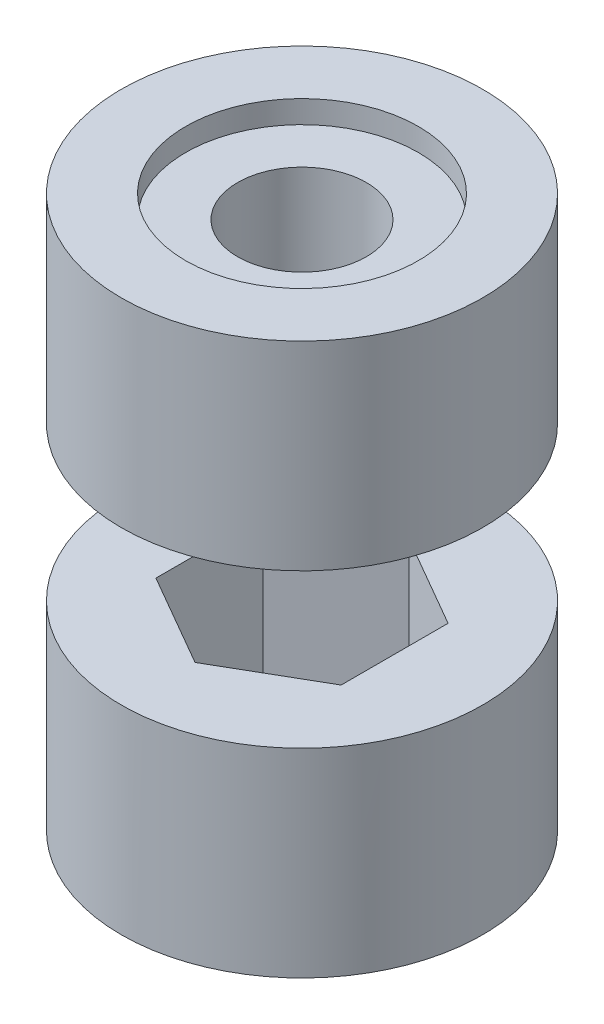
ISO-10303-21;
HEADER;
FILE_DESCRIPTION(('STEP AP214'),'2;1');
FILE_NAME('part.step','',(''),(''),'','','');
FILE_SCHEMA(('AUTOMOTIVE_DESIGN { 1 0 10303 214 1 1 1 1 }'));
ENDSEC;
DATA;
#1=APPLICATION_CONTEXT('core data for automotive mechanical design processes');
#2=APPLICATION_PROTOCOL_DEFINITION('international standard','automotive_design',2000,#1);
#3=PRODUCT_CONTEXT('',#1,'mechanical');
#4=PRODUCT('Part','Part','',(#3));
#5=PRODUCT_RELATED_PRODUCT_CATEGORY('part','',(#4));
#6=PRODUCT_DEFINITION_FORMATION('','',#4);
#7=PRODUCT_DEFINITION_CONTEXT('part definition',#1,'design');
#8=PRODUCT_DEFINITION('design','',#6,#7);
#9=PRODUCT_DEFINITION_SHAPE('','',#8);
#10=(LENGTH_UNIT() NAMED_UNIT(*) SI_UNIT(.MILLI.,.METRE.));
#11=(NAMED_UNIT(*) PLANE_ANGLE_UNIT() SI_UNIT($,.RADIAN.));
#12=(NAMED_UNIT(*) SI_UNIT($,.STERADIAN.) SOLID_ANGLE_UNIT());
#13=UNCERTAINTY_MEASURE_WITH_UNIT(LENGTH_MEASURE(1.E-05),#10,'distance_accuracy_value','');
#14=(GEOMETRIC_REPRESENTATION_CONTEXT(3) GLOBAL_UNCERTAINTY_ASSIGNED_CONTEXT((#13)) GLOBAL_UNIT_ASSIGNED_CONTEXT((#10,
#11,#12)) REPRESENTATION_CONTEXT('',''));
#15=CARTESIAN_POINT('',(0.,0.,0.));
#16=DIRECTION('',(0.,0.,1.));
#17=DIRECTION('',(1.,0.,0.));
#18=AXIS2_PLACEMENT_3D('',#15,#16,#17);
#19=CARTESIAN_POINT('',(0.,24.418,0.));
#20=DIRECTION('',(0.,-1.,0.));
#21=DIRECTION('',(0.,0.,-1.));
#22=AXIS2_PLACEMENT_3D('',#19,#20,#21);
#23=CYLINDRICAL_SURFACE('',#22,2.85);
#24=CARTESIAN_POINT('',(0.,15.609,0.));
#25=DIRECTION('',(0.,1.,0.));
#26=DIRECTION('',(0.,0.,1.));
#27=AXIS2_PLACEMENT_3D('',#24,#25,#26);
#28=CIRCLE('',#27,2.85);
#29=CARTESIAN_POINT('',(0.,15.609,2.85));
#30=VERTEX_POINT('',#29);
#31=EDGE_CURVE('E62',#30,#30,#28,.F.);
#32=ORIENTED_EDGE('',*,*,#31,.T.);
#33=EDGE_LOOP('',(#32));
#34=FACE_BOUND('',#33,.T.);
#35=CARTESIAN_POINT('',(0.,23.418,0.));
#36=DIRECTION('',(0.,1.,0.));
#37=DIRECTION('',(0.,0.,1.));
#38=AXIS2_PLACEMENT_3D('',#35,#36,#37);
#39=CIRCLE('',#38,2.85);
#40=CARTESIAN_POINT('',(0.,23.418,2.85));
#41=VERTEX_POINT('',#40);
#42=EDGE_CURVE('E53',#41,#41,#39,.T.);
#43=ORIENTED_EDGE('',*,*,#42,.T.);
#44=EDGE_LOOP('',(#43));
#45=FACE_BOUND('',#44,.T.);
#46=ADVANCED_FACE('F49',(#34,#45),#23,.F.);
#47=CARTESIAN_POINT('',(0.,24.418,0.));
#48=DIRECTION('',(0.,-1.,0.));
#49=DIRECTION('',(0.,0.,-1.));
#50=AXIS2_PLACEMENT_3D('',#47,#48,#49);
#51=CYLINDRICAL_SURFACE('',#50,8.);
#52=CARTESIAN_POINT('',(0.,24.418,0.));
#53=DIRECTION('',(0.,1.,0.));
#54=DIRECTION('',(0.,0.,1.));
#55=AXIS2_PLACEMENT_3D('',#52,#53,#54);
#56=CIRCLE('',#55,8.);
#57=CARTESIAN_POINT('',(0.,24.418,8.));
#58=VERTEX_POINT('',#57);
#59=EDGE_CURVE('E11',#58,#58,#56,.T.);
#60=ORIENTED_EDGE('',*,*,#59,.F.);
#61=EDGE_LOOP('',(#60));
#62=FACE_BOUND('',#61,.T.);
#63=CARTESIAN_POINT('',(0.,15.609,0.));
#64=DIRECTION('',(0.,1.,0.));
#65=DIRECTION('',(0.,0.,1.));
#66=AXIS2_PLACEMENT_3D('',#63,#64,#65);
#67=CIRCLE('',#66,8.);
#68=CARTESIAN_POINT('',(0.,15.609,8.));
#69=VERTEX_POINT('',#68);
#70=EDGE_CURVE('E57',#69,#69,#67,.T.);
#71=ORIENTED_EDGE('',*,*,#70,.T.);
#72=EDGE_LOOP('',(#71));
#73=FACE_BOUND('',#72,.T.);
#74=ADVANCED_FACE('F51',(#62,#73),#51,.T.);
#75=CARTESIAN_POINT('',(0.,24.418,0.));
#76=DIRECTION('',(0.,1.,0.));
#77=DIRECTION('',(0.,0.,1.));
#78=AXIS2_PLACEMENT_3D('',#75,#76,#77);
#79=PLANE('',#78);
#80=CARTESIAN_POINT('',(0.,24.418,0.));
#81=DIRECTION('',(0.,1.,0.));
#82=DIRECTION('',(0.,0.,1.));
#83=AXIS2_PLACEMENT_3D('',#80,#81,#82);
#84=CIRCLE('',#83,5.15);
#85=CARTESIAN_POINT('',(0.,24.418,5.15));
#86=VERTEX_POINT('',#85);
#87=EDGE_CURVE('E73',#86,#86,#84,.T.);
#88=ORIENTED_EDGE('',*,*,#87,.F.);
#89=EDGE_LOOP('',(#88));
#90=FACE_BOUND('',#89,.T.);
#91=ORIENTED_EDGE('',*,*,#59,.T.);
#92=EDGE_LOOP('',(#91));
#93=FACE_BOUND('',#92,.T.);
#94=ADVANCED_FACE('F82',(#90,#93),#79,.T.);
#95=CARTESIAN_POINT('',(10.2,15.609,-8.));
#96=DIRECTION('',(0.,1.,0.));
#97=DIRECTION('',(0.,0.,1.));
#98=AXIS2_PLACEMENT_3D('',#95,#96,#97);
#99=PLANE('',#98);
#100=ORIENTED_EDGE('',*,*,#31,.F.);
#101=EDGE_LOOP('',(#100));
#102=FACE_BOUND('',#101,.T.);
#103=ORIENTED_EDGE('',*,*,#70,.F.);
#104=EDGE_LOOP('',(#103));
#105=FACE_BOUND('',#104,.T.);
#106=ADVANCED_FACE('F84',(#102,#105),#99,.F.);
#107=CARTESIAN_POINT('',(0.,23.418,0.));
#108=DIRECTION('',(0.,1.,0.));
#109=DIRECTION('',(0.,0.,1.));
#110=AXIS2_PLACEMENT_3D('',#107,#108,#109);
#111=CYLINDRICAL_SURFACE('',#110,5.15);
#112=CARTESIAN_POINT('',(0.,23.418,0.));
#113=DIRECTION('',(0.,1.,0.));
#114=DIRECTION('',(0.,0.,1.));
#115=AXIS2_PLACEMENT_3D('',#112,#113,#114);
#116=CIRCLE('',#115,5.15);
#117=CARTESIAN_POINT('',(0.,23.418,5.15));
#118=VERTEX_POINT('',#117);
#119=EDGE_CURVE('E69',#118,#118,#116,.T.);
#120=ORIENTED_EDGE('',*,*,#119,.F.);
#121=EDGE_LOOP('',(#120));
#122=FACE_BOUND('',#121,.T.);
#123=ORIENTED_EDGE('',*,*,#87,.T.);
#124=EDGE_LOOP('',(#123));
#125=FACE_BOUND('',#124,.T.);
#126=ADVANCED_FACE('F80',(#122,#125),#111,.F.);
#127=CARTESIAN_POINT('',(0.,23.418,0.));
#128=DIRECTION('',(0.,1.,0.));
#129=DIRECTION('',(0.,0.,1.));
#130=AXIS2_PLACEMENT_3D('',#127,#128,#129);
#131=PLANE('',#130);
#132=ORIENTED_EDGE('',*,*,#42,.F.);
#133=EDGE_LOOP('',(#132));
#134=FACE_BOUND('',#133,.T.);
#135=ORIENTED_EDGE('',*,*,#119,.T.);
#136=EDGE_LOOP('',(#135));
#137=FACE_BOUND('',#136,.T.);
#138=ADVANCED_FACE('F99',(#134,#137),#131,.T.);
#139=CLOSED_SHELL('',(#46,#74,#94,#106,#126,#138));
#140=MANIFOLD_SOLID_BREP('B2',#139);
#141=CARTESIAN_POINT('',(0.,0.,0.));
#142=DIRECTION('',(0.,1.,0.));
#143=DIRECTION('',(0.,0.,1.));
#144=AXIS2_PLACEMENT_3D('',#141,#142,#143);
#145=PLANE('',#144);
#146=CARTESIAN_POINT('',(0.,0.,0.));
#147=DIRECTION('',(0.,1.,0.));
#148=DIRECTION('',(0.,0.,1.));
#149=AXIS2_PLACEMENT_3D('',#146,#147,#148);
#150=CIRCLE('',#149,8.);
#151=CARTESIAN_POINT('',(0.,0.,8.));
#152=VERTEX_POINT('',#151);
#153=EDGE_CURVE('E198',#152,#152,#150,.T.);
#154=ORIENTED_EDGE('',*,*,#153,.F.);
#155=EDGE_LOOP('',(#154));
#156=FACE_BOUND('',#155,.T.);
#157=DIRECTION('',(0.,0.,-1.));
#158=VECTOR('',#157,1.);
#159=CARTESIAN_POINT('',(4.1,0.,-2.36713610367746));
#160=LINE('',#159,#158);
#161=CARTESIAN_POINT('',(4.1,0.,2.36713610367747));
#162=VERTEX_POINT('',#161);
#163=CARTESIAN_POINT('',(4.1,0.,-2.36713610367746));
#164=VERTEX_POINT('',#163);
#165=EDGE_CURVE('E156',#162,#164,#160,.T.);
#166=ORIENTED_EDGE('',*,*,#165,.T.);
#167=DIRECTION('',(-0.866025403784439,0.,-0.5));
#168=VECTOR('',#167,1.);
#169=CARTESIAN_POINT('',(0.,0.,-4.73427220735493));
#170=LINE('',#169,#168);
#171=CARTESIAN_POINT('',(0.,0.,-4.73427220735493));
#172=VERTEX_POINT('',#171);
#173=EDGE_CURVE('E202',#164,#172,#170,.T.);
#174=ORIENTED_EDGE('',*,*,#173,.T.);
#175=DIRECTION('',(-0.866025403784438,0.,0.5));
#176=VECTOR('',#175,1.);
#177=CARTESIAN_POINT('',(-4.1,0.,-2.36713610367746));
#178=LINE('',#177,#176);
#179=CARTESIAN_POINT('',(-4.1,0.,-2.36713610367746));
#180=VERTEX_POINT('',#179);
#181=EDGE_CURVE('E208',#172,#180,#178,.T.);
#182=ORIENTED_EDGE('',*,*,#181,.T.);
#183=DIRECTION('',(0.,0.,1.));
#184=VECTOR('',#183,1.);
#185=CARTESIAN_POINT('',(-4.1,0.,2.36713610367747));
#186=LINE('',#185,#184);
#187=CARTESIAN_POINT('',(-4.1,0.,2.36713610367747));
#188=VERTEX_POINT('',#187);
#189=EDGE_CURVE('E216',#180,#188,#186,.T.);
#190=ORIENTED_EDGE('',*,*,#189,.T.);
#191=DIRECTION('',(0.866025403784439,0.,0.5));
#192=VECTOR('',#191,1.);
#193=CARTESIAN_POINT('',(0.,0.,4.73427220735493));
#194=LINE('',#193,#192);
#195=CARTESIAN_POINT('',(0.,0.,4.73427220735493));
#196=VERTEX_POINT('',#195);
#197=EDGE_CURVE('E219',#188,#196,#194,.T.);
#198=ORIENTED_EDGE('',*,*,#197,.T.);
#199=DIRECTION('',(0.866025403784439,0.,-0.5));
#200=VECTOR('',#199,1.);
#201=CARTESIAN_POINT('',(4.1,0.,2.36713610367747));
#202=LINE('',#201,#200);
#203=EDGE_CURVE('E212',#196,#162,#202,.T.);
#204=ORIENTED_EDGE('',*,*,#203,.T.);
#205=EDGE_LOOP('',(#166,#174,#182,#190,#198,#204));
#206=FACE_BOUND('',#205,.T.);
#207=ADVANCED_FACE('F141',(#156,#206),#145,.F.);
#208=CARTESIAN_POINT('',(-10.2,8.809,-8.));
#209=DIRECTION('',(0.,-1.,0.));
#210=DIRECTION('',(0.,0.,-1.));
#211=AXIS2_PLACEMENT_3D('',#208,#209,#210);
#212=PLANE('',#211);
#213=CARTESIAN_POINT('',(0.,8.809,0.));
#214=DIRECTION('',(0.,-1.,0.));
#215=DIRECTION('',(0.,0.,-1.));
#216=AXIS2_PLACEMENT_3D('',#213,#214,#215);
#217=CIRCLE('',#216,8.);
#218=CARTESIAN_POINT('',(0.,8.809,-8.));
#219=VERTEX_POINT('',#218);
#220=EDGE_CURVE('E232',#219,#219,#217,.T.);
#221=ORIENTED_EDGE('',*,*,#220,.F.);
#222=EDGE_LOOP('',(#221));
#223=FACE_BOUND('',#222,.T.);
#224=DIRECTION('',(0.,0.,-1.));
#225=VECTOR('',#224,1.);
#226=CARTESIAN_POINT('',(4.1,8.809,-8.));
#227=LINE('',#226,#225);
#228=CARTESIAN_POINT('',(4.1,8.809,2.36713610367747));
#229=VERTEX_POINT('',#228);
#230=CARTESIAN_POINT('',(4.1,8.809,-2.36713610367746));
#231=VERTEX_POINT('',#230);
#232=EDGE_CURVE('E47',#229,#231,#227,.T.);
#233=ORIENTED_EDGE('',*,*,#232,.F.);
#234=DIRECTION('',(0.866025403784439,0.,-0.5));
#235=VECTOR('',#234,1.);
#236=CARTESIAN_POINT('',(-2.13589838486225,8.809,5.96743371481683));
#237=LINE('',#236,#235);
#238=CARTESIAN_POINT('',(0.,8.809,4.73427220735493));
#239=VERTEX_POINT('',#238);
#240=EDGE_CURVE('E235',#239,#229,#237,.T.);
#241=ORIENTED_EDGE('',*,*,#240,.F.);
#242=DIRECTION('',(0.866025403784439,0.,0.5));
#243=VECTOR('',#242,1.);
#244=CARTESIAN_POINT('',(-13.1641016151378,8.809,-2.86602540378443));
#245=LINE('',#244,#243);
#246=CARTESIAN_POINT('',(-4.1,8.809,2.36713610367747));
#247=VERTEX_POINT('',#246);
#248=EDGE_CURVE('E237',#247,#239,#245,.T.);
#249=ORIENTED_EDGE('',*,*,#248,.F.);
#250=DIRECTION('',(0.,0.,1.));
#251=VECTOR('',#250,1.);
#252=CARTESIAN_POINT('',(-4.1,8.809,-8.));
#253=LINE('',#252,#251);
#254=CARTESIAN_POINT('',(-4.1,8.809,-2.36713610367746));
#255=VERTEX_POINT('',#254);
#256=EDGE_CURVE('E239',#255,#247,#253,.T.);
#257=ORIENTED_EDGE('',*,*,#256,.F.);
#258=DIRECTION('',(-0.866025403784439,0.,0.5));
#259=VECTOR('',#258,1.);
#260=CARTESIAN_POINT('',(-6.23589838486224,8.809,-1.13397459621556));
#261=LINE('',#260,#259);
#262=CARTESIAN_POINT('',(0.,8.809,-4.73427220735493));
#263=VERTEX_POINT('',#262);
#264=EDGE_CURVE('E241',#263,#255,#261,.T.);
#265=ORIENTED_EDGE('',*,*,#264,.F.);
#266=DIRECTION('',(-0.866025403784439,0.,-0.5));
#267=VECTOR('',#266,1.);
#268=CARTESIAN_POINT('',(-9.06410161513775,8.809,-9.96743371481684));
#269=LINE('',#268,#267);
#270=EDGE_CURVE('E149',#231,#263,#269,.T.);
#271=ORIENTED_EDGE('',*,*,#270,.F.);
#272=EDGE_LOOP('',(#233,#241,#249,#257,#265,#271));
#273=FACE_BOUND('',#272,.T.);
#274=ADVANCED_FACE('F248',(#223,#273),#212,.F.);
#275=CARTESIAN_POINT('',(0.,24.418,0.));
#276=DIRECTION('',(0.,-1.,0.));
#277=DIRECTION('',(0.,0.,-1.));
#278=AXIS2_PLACEMENT_3D('',#275,#276,#277);
#279=CYLINDRICAL_SURFACE('',#278,8.);
#280=ORIENTED_EDGE('',*,*,#220,.T.);
#281=EDGE_LOOP('',(#280));
#282=FACE_BOUND('',#281,.T.);
#283=ORIENTED_EDGE('',*,*,#153,.T.);
#284=EDGE_LOOP('',(#283));
#285=FACE_BOUND('',#284,.T.);
#286=ADVANCED_FACE('F143',(#282,#285),#279,.T.);
#287=CARTESIAN_POINT('',(4.1,9.,-2.36713610367746));
#288=DIRECTION('',(-1.,0.,0.));
#289=DIRECTION('',(0.,0.,1.));
#290=AXIS2_PLACEMENT_3D('',#287,#288,#289);
#291=PLANE('',#290);
#292=ORIENTED_EDGE('',*,*,#232,.T.);
#293=DIRECTION('',(0.,-1.,0.));
#294=VECTOR('',#293,1.);
#295=CARTESIAN_POINT('',(4.1,9.,-2.36713610367746));
#296=LINE('',#295,#294);
#297=EDGE_CURVE('E192',#231,#164,#296,.T.);
#298=ORIENTED_EDGE('',*,*,#297,.T.);
#299=ORIENTED_EDGE('',*,*,#165,.F.);
#300=DIRECTION('',(0.,-1.,0.));
#301=VECTOR('',#300,1.);
#302=CARTESIAN_POINT('',(4.1,9.,2.36713610367747));
#303=LINE('',#302,#301);
#304=EDGE_CURVE('E222',#229,#162,#303,.T.);
#305=ORIENTED_EDGE('',*,*,#304,.F.);
#306=EDGE_LOOP('',(#292,#298,#299,#305));
#307=FACE_BOUND('',#306,.T.);
#308=ADVANCED_FACE('F194',(#307),#291,.T.);
#309=CARTESIAN_POINT('',(0.,9.,-4.73427220735493));
#310=DIRECTION('',(-0.5,0.,0.866025403784439));
#311=DIRECTION('',(0.866025403784439,0.,0.5));
#312=AXIS2_PLACEMENT_3D('',#309,#310,#311);
#313=PLANE('',#312);
#314=ORIENTED_EDGE('',*,*,#270,.T.);
#315=DIRECTION('',(0.,-1.,0.));
#316=VECTOR('',#315,1.);
#317=CARTESIAN_POINT('',(0.,9.,-4.73427220735493));
#318=LINE('',#317,#316);
#319=EDGE_CURVE('E199',#263,#172,#318,.T.);
#320=ORIENTED_EDGE('',*,*,#319,.T.);
#321=ORIENTED_EDGE('',*,*,#173,.F.);
#322=ORIENTED_EDGE('',*,*,#297,.F.);
#323=EDGE_LOOP('',(#314,#320,#321,#322));
#324=FACE_BOUND('',#323,.T.);
#325=ADVANCED_FACE('F203',(#324),#313,.T.);
#326=CARTESIAN_POINT('',(-4.1,9.,-2.36713610367746));
#327=DIRECTION('',(0.5,0.,0.866025403784438));
#328=DIRECTION('',(0.866025403784439,0.,-0.5));
#329=AXIS2_PLACEMENT_3D('',#326,#327,#328);
#330=PLANE('',#329);
#331=ORIENTED_EDGE('',*,*,#264,.T.);
#332=DIRECTION('',(0.,-1.,0.));
#333=VECTOR('',#332,1.);
#334=CARTESIAN_POINT('',(-4.1,9.,-2.36713610367746));
#335=LINE('',#334,#333);
#336=EDGE_CURVE('E227',#255,#180,#335,.T.);
#337=ORIENTED_EDGE('',*,*,#336,.T.);
#338=ORIENTED_EDGE('',*,*,#181,.F.);
#339=ORIENTED_EDGE('',*,*,#319,.F.);
#340=EDGE_LOOP('',(#331,#337,#338,#339));
#341=FACE_BOUND('',#340,.T.);
#342=ADVANCED_FACE('F245',(#341),#330,.T.);
#343=CARTESIAN_POINT('',(-4.1,9.,2.36713610367747));
#344=DIRECTION('',(1.,0.,0.));
#345=DIRECTION('',(0.,0.,-1.));
#346=AXIS2_PLACEMENT_3D('',#343,#344,#345);
#347=PLANE('',#346);
#348=ORIENTED_EDGE('',*,*,#256,.T.);
#349=DIRECTION('',(0.,-1.,0.));
#350=VECTOR('',#349,1.);
#351=CARTESIAN_POINT('',(-4.1,9.,2.36713610367747));
#352=LINE('',#351,#350);
#353=EDGE_CURVE('E225',#247,#188,#352,.T.);
#354=ORIENTED_EDGE('',*,*,#353,.T.);
#355=ORIENTED_EDGE('',*,*,#189,.F.);
#356=ORIENTED_EDGE('',*,*,#336,.F.);
#357=EDGE_LOOP('',(#348,#354,#355,#356));
#358=FACE_BOUND('',#357,.T.);
#359=ADVANCED_FACE('F253',(#358),#347,.T.);
#360=CARTESIAN_POINT('',(0.,9.,4.73427220735493));
#361=DIRECTION('',(0.5,0.,-0.866025403784439));
#362=DIRECTION('',(-0.866025403784439,0.,-0.5));
#363=AXIS2_PLACEMENT_3D('',#360,#361,#362);
#364=PLANE('',#363);
#365=ORIENTED_EDGE('',*,*,#248,.T.);
#366=DIRECTION('',(0.,-1.,0.));
#367=VECTOR('',#366,1.);
#368=CARTESIAN_POINT('',(0.,9.,4.73427220735493));
#369=LINE('',#368,#367);
#370=EDGE_CURVE('E164',#239,#196,#369,.T.);
#371=ORIENTED_EDGE('',*,*,#370,.T.);
#372=ORIENTED_EDGE('',*,*,#197,.F.);
#373=ORIENTED_EDGE('',*,*,#353,.F.);
#374=EDGE_LOOP('',(#365,#371,#372,#373));
#375=FACE_BOUND('',#374,.T.);
#376=ADVANCED_FACE('F257',(#375),#364,.T.);
#377=CARTESIAN_POINT('',(4.1,9.,2.36713610367747));
#378=DIRECTION('',(-0.5,0.,-0.866025403784439));
#379=DIRECTION('',(-0.866025403784439,0.,0.5));
#380=AXIS2_PLACEMENT_3D('',#377,#378,#379);
#381=PLANE('',#380);
#382=ORIENTED_EDGE('',*,*,#240,.T.);
#383=ORIENTED_EDGE('',*,*,#304,.T.);
#384=ORIENTED_EDGE('',*,*,#203,.F.);
#385=ORIENTED_EDGE('',*,*,#370,.F.);
#386=EDGE_LOOP('',(#382,#383,#384,#385));
#387=FACE_BOUND('',#386,.T.);
#388=ADVANCED_FACE('F258',(#387),#381,.T.);
#389=CLOSED_SHELL('',(#207,#274,#286,#308,#325,#342,#359,#376,#388));
#390=MANIFOLD_SOLID_BREP('B6',#389);
#391=ADVANCED_BREP_SHAPE_REPRESENTATION('',(#18,#140,#390),#14);
#392=SHAPE_DEFINITION_REPRESENTATION(#9,#391);
ENDSEC;
END-ISO-10303-21;
